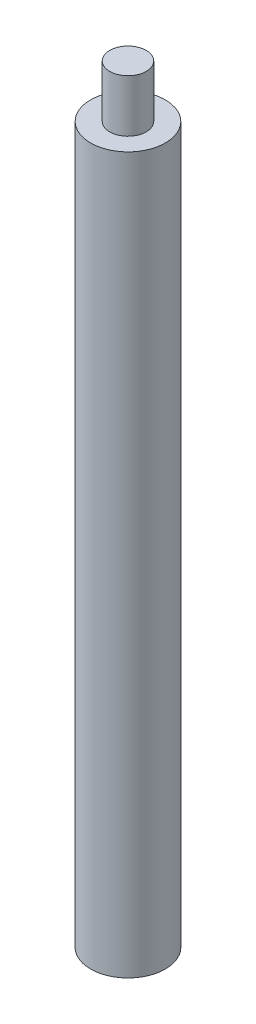
ISO-10303-21;
HEADER;
FILE_DESCRIPTION(('STEP AP214'),'2;1');
FILE_NAME('part.step','',(''),(''),'','','');
FILE_SCHEMA(('AUTOMOTIVE_DESIGN { 1 0 10303 214 1 1 1 1 }'));
ENDSEC;
DATA;
#1=APPLICATION_CONTEXT('core data for automotive mechanical design processes');
#2=APPLICATION_PROTOCOL_DEFINITION('international standard','automotive_design',2000,#1);
#3=PRODUCT_CONTEXT('',#1,'mechanical');
#4=PRODUCT('Part','Part','',(#3));
#5=PRODUCT_RELATED_PRODUCT_CATEGORY('part','',(#4));
#6=PRODUCT_DEFINITION_FORMATION('','',#4);
#7=PRODUCT_DEFINITION_CONTEXT('part definition',#1,'design');
#8=PRODUCT_DEFINITION('design','',#6,#7);
#9=PRODUCT_DEFINITION_SHAPE('','',#8);
#10=(LENGTH_UNIT() NAMED_UNIT(*) SI_UNIT(.MILLI.,.METRE.));
#11=(NAMED_UNIT(*) PLANE_ANGLE_UNIT() SI_UNIT($,.RADIAN.));
#12=(NAMED_UNIT(*) SI_UNIT($,.STERADIAN.) SOLID_ANGLE_UNIT());
#13=UNCERTAINTY_MEASURE_WITH_UNIT(LENGTH_MEASURE(1.E-05),#10,'distance_accuracy_value','');
#14=(GEOMETRIC_REPRESENTATION_CONTEXT(3) GLOBAL_UNCERTAINTY_ASSIGNED_CONTEXT((#13)) GLOBAL_UNIT_ASSIGNED_CONTEXT((#10,
#11,#12)) REPRESENTATION_CONTEXT('',''));
#15=CARTESIAN_POINT('',(0.,0.,0.));
#16=DIRECTION('',(0.,0.,1.));
#17=DIRECTION('',(1.,0.,0.));
#18=AXIS2_PLACEMENT_3D('',#15,#16,#17);
#19=CARTESIAN_POINT('',(0.,157.,0.));
#20=DIRECTION('',(0.,1.,0.));
#21=DIRECTION('',(0.,0.,1.));
#22=AXIS2_PLACEMENT_3D('',#19,#20,#21);
#23=PLANE('',#22);
#24=CARTESIAN_POINT('',(0.,157.,0.));
#25=DIRECTION('',(0.,1.,0.));
#26=DIRECTION('',(0.,0.,1.));
#27=AXIS2_PLACEMENT_3D('',#24,#25,#26);
#28=CIRCLE('',#27,8.2);
#29=CARTESIAN_POINT('',(0.,157.,8.2));
#30=VERTEX_POINT('',#29);
#31=EDGE_CURVE('E10',#30,#30,#28,.T.);
#32=ORIENTED_EDGE('',*,*,#31,.T.);
#33=EDGE_LOOP('',(#32));
#34=FACE_BOUND('',#33,.T.);
#35=CARTESIAN_POINT('',(0.,157.,0.));
#36=DIRECTION('',(0.,1.,0.));
#37=DIRECTION('',(0.,0.,1.));
#38=AXIS2_PLACEMENT_3D('',#35,#36,#37);
#39=CIRCLE('',#38,4.);
#40=CARTESIAN_POINT('',(0.,157.,4.));
#41=VERTEX_POINT('',#40);
#42=EDGE_CURVE('E50',#41,#41,#39,.T.);
#43=ORIENTED_EDGE('',*,*,#42,.F.);
#44=EDGE_LOOP('',(#43));
#45=FACE_BOUND('',#44,.T.);
#46=ADVANCED_FACE('F31',(#34,#45),#23,.T.);
#47=CARTESIAN_POINT('',(0.,157.,0.));
#48=DIRECTION('',(0.,-1.,0.));
#49=DIRECTION('',(0.,0.,-1.));
#50=AXIS2_PLACEMENT_3D('',#47,#48,#49);
#51=CYLINDRICAL_SURFACE('',#50,8.2);
#52=ORIENTED_EDGE('',*,*,#31,.F.);
#53=EDGE_LOOP('',(#52));
#54=FACE_BOUND('',#53,.T.);
#55=CARTESIAN_POINT('',(0.,0.,0.));
#56=DIRECTION('',(0.,1.,0.));
#57=DIRECTION('',(0.,0.,1.));
#58=AXIS2_PLACEMENT_3D('',#55,#56,#57);
#59=CIRCLE('',#58,8.2);
#60=CARTESIAN_POINT('',(0.,0.,8.2));
#61=VERTEX_POINT('',#60);
#62=EDGE_CURVE('E35',#61,#61,#59,.T.);
#63=ORIENTED_EDGE('',*,*,#62,.T.);
#64=EDGE_LOOP('',(#63));
#65=FACE_BOUND('',#64,.T.);
#66=ADVANCED_FACE('F33',(#54,#65),#51,.T.);
#67=CARTESIAN_POINT('',(0.,0.,0.));
#68=DIRECTION('',(0.,1.,0.));
#69=DIRECTION('',(0.,0.,1.));
#70=AXIS2_PLACEMENT_3D('',#67,#68,#69);
#71=PLANE('',#70);
#72=CARTESIAN_POINT('',(0.,0.,0.));
#73=DIRECTION('',(0.,-1.,0.));
#74=DIRECTION('',(0.,0.,-1.));
#75=AXIS2_PLACEMENT_3D('',#72,#73,#74);
#76=CIRCLE('',#75,2.1);
#77=CARTESIAN_POINT('',(0.,0.,-2.1));
#78=VERTEX_POINT('',#77);
#79=EDGE_CURVE('E44',#78,#78,#76,.T.);
#80=ORIENTED_EDGE('',*,*,#79,.F.);
#81=EDGE_LOOP('',(#80));
#82=FACE_BOUND('',#81,.T.);
#83=ORIENTED_EDGE('',*,*,#62,.F.);
#84=EDGE_LOOP('',(#83));
#85=FACE_BOUND('',#84,.T.);
#86=ADVANCED_FACE('F70',(#82,#85),#71,.F.);
#87=CARTESIAN_POINT('',(0.,10.,0.));
#88=DIRECTION('',(0.,-1.,0.));
#89=DIRECTION('',(0.,0.,-1.));
#90=AXIS2_PLACEMENT_3D('',#87,#88,#89);
#91=CYLINDRICAL_SURFACE('',#90,2.1);
#92=CARTESIAN_POINT('',(0.,10.,0.));
#93=DIRECTION('',(0.,-1.,0.));
#94=DIRECTION('',(0.,0.,-1.));
#95=AXIS2_PLACEMENT_3D('',#92,#93,#94);
#96=CIRCLE('',#95,2.1);
#97=CARTESIAN_POINT('',(0.,10.,-2.1));
#98=VERTEX_POINT('',#97);
#99=EDGE_CURVE('E42',#98,#98,#96,.T.);
#100=ORIENTED_EDGE('',*,*,#99,.F.);
#101=EDGE_LOOP('',(#100));
#102=FACE_BOUND('',#101,.T.);
#103=ORIENTED_EDGE('',*,*,#79,.T.);
#104=EDGE_LOOP('',(#103));
#105=FACE_BOUND('',#104,.T.);
#106=ADVANCED_FACE('F73',(#102,#105),#91,.F.);
#107=CARTESIAN_POINT('',(0.,10.,0.));
#108=DIRECTION('',(0.,-1.,0.));
#109=DIRECTION('',(0.,0.,-1.));
#110=AXIS2_PLACEMENT_3D('',#107,#108,#109);
#111=PLANE('',#110);
#112=ORIENTED_EDGE('',*,*,#99,.T.);
#113=EDGE_LOOP('',(#112));
#114=FACE_BOUND('',#113,.T.);
#115=ADVANCED_FACE('F61',(#114),#111,.T.);
#116=CARTESIAN_POINT('',(0.,168.5,0.));
#117=DIRECTION('',(0.,-1.,0.));
#118=DIRECTION('',(0.,0.,-1.));
#119=AXIS2_PLACEMENT_3D('',#116,#117,#118);
#120=CYLINDRICAL_SURFACE('',#119,4.);
#121=CARTESIAN_POINT('',(0.,168.5,0.));
#122=DIRECTION('',(0.,1.,0.));
#123=DIRECTION('',(0.,0.,1.));
#124=AXIS2_PLACEMENT_3D('',#121,#122,#123);
#125=CIRCLE('',#124,4.);
#126=CARTESIAN_POINT('',(0.,168.5,4.));
#127=VERTEX_POINT('',#126);
#128=EDGE_CURVE('E47',#127,#127,#125,.T.);
#129=ORIENTED_EDGE('',*,*,#128,.F.);
#130=EDGE_LOOP('',(#129));
#131=FACE_BOUND('',#130,.T.);
#132=ORIENTED_EDGE('',*,*,#42,.T.);
#133=EDGE_LOOP('',(#132));
#134=FACE_BOUND('',#133,.T.);
#135=ADVANCED_FACE('F58',(#131,#134),#120,.T.);
#136=CARTESIAN_POINT('',(0.,168.5,0.));
#137=DIRECTION('',(0.,1.,0.));
#138=DIRECTION('',(0.,0.,1.));
#139=AXIS2_PLACEMENT_3D('',#136,#137,#138);
#140=PLANE('',#139);
#141=ORIENTED_EDGE('',*,*,#128,.T.);
#142=EDGE_LOOP('',(#141));
#143=FACE_BOUND('',#142,.T.);
#144=ADVANCED_FACE('F56',(#143),#140,.T.);
#145=CLOSED_SHELL('',(#46,#66,#86,#106,#115,#135,#144));
#146=MANIFOLD_SOLID_BREP('B2',#145);
#147=ADVANCED_BREP_SHAPE_REPRESENTATION('',(#18,#146),#14);
#148=SHAPE_DEFINITION_REPRESENTATION(#9,#147);
ENDSEC;
END-ISO-10303-21;
